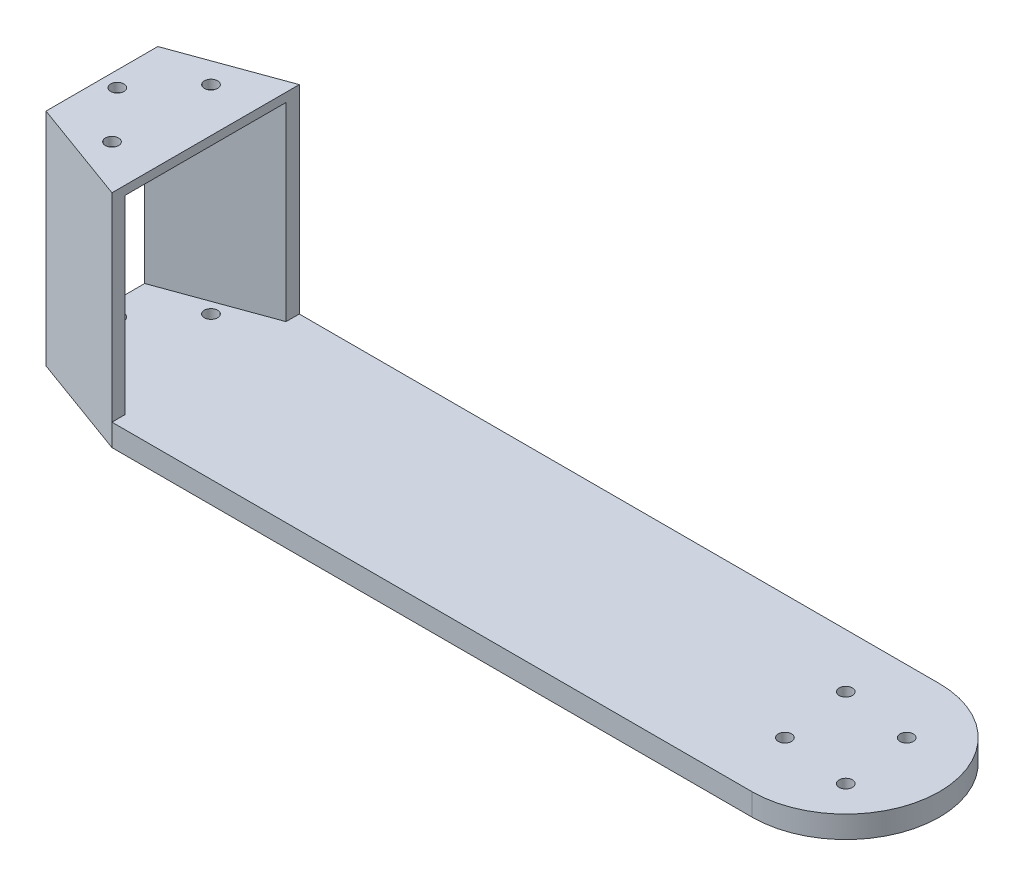
ISO-10303-21;
HEADER;
FILE_DESCRIPTION(('STEP AP214'),'2;1');
FILE_NAME('part.step','',(''),(''),'','','');
FILE_SCHEMA(('AUTOMOTIVE_DESIGN { 1 0 10303 214 1 1 1 1 }'));
ENDSEC;
DATA;
#1=APPLICATION_CONTEXT('core data for automotive mechanical design processes');
#2=APPLICATION_PROTOCOL_DEFINITION('international standard','automotive_design',2000,#1);
#3=PRODUCT_CONTEXT('',#1,'mechanical');
#4=PRODUCT('Part','Part','',(#3));
#5=PRODUCT_RELATED_PRODUCT_CATEGORY('part','',(#4));
#6=PRODUCT_DEFINITION_FORMATION('','',#4);
#7=PRODUCT_DEFINITION_CONTEXT('part definition',#1,'design');
#8=PRODUCT_DEFINITION('design','',#6,#7);
#9=PRODUCT_DEFINITION_SHAPE('','',#8);
#10=(LENGTH_UNIT() NAMED_UNIT(*) SI_UNIT(.MILLI.,.METRE.));
#11=(NAMED_UNIT(*) PLANE_ANGLE_UNIT() SI_UNIT($,.RADIAN.));
#12=(NAMED_UNIT(*) SI_UNIT($,.STERADIAN.) SOLID_ANGLE_UNIT());
#13=UNCERTAINTY_MEASURE_WITH_UNIT(LENGTH_MEASURE(1.E-05),#10,'distance_accuracy_value','');
#14=(GEOMETRIC_REPRESENTATION_CONTEXT(3) GLOBAL_UNCERTAINTY_ASSIGNED_CONTEXT((#13)) GLOBAL_UNIT_ASSIGNED_CONTEXT((#10,
#11,#12)) REPRESENTATION_CONTEXT('',''));
#15=CARTESIAN_POINT('',(0.,0.,0.));
#16=DIRECTION('',(0.,0.,1.));
#17=DIRECTION('',(1.,0.,0.));
#18=AXIS2_PLACEMENT_3D('',#15,#16,#17);
#19=CARTESIAN_POINT('',(49.3147291292976,5.,-35.8156635552348));
#20=DIRECTION('',(1.,0.,0.));
#21=DIRECTION('',(0.,0.,-1.));
#22=AXIS2_PLACEMENT_3D('',#19,#20,#21);
#23=PLANE('',#22);
#24=DIRECTION('',(0.,0.,1.));
#25=VECTOR('',#24,1.);
#26=CARTESIAN_POINT('',(49.3147291292976,0.,-35.8156635552348));
#27=LINE('',#26,#25);
#28=CARTESIAN_POINT('',(49.3147291292976,0.,-35.8156635552348));
#29=VERTEX_POINT('',#28);
#30=CARTESIAN_POINT('',(49.3147291292976,0.,-10.4866707215182));
#31=VERTEX_POINT('',#30);
#32=EDGE_CURVE('E242',#29,#31,#27,.T.);
#33=ORIENTED_EDGE('',*,*,#32,.T.);
#34=DIRECTION('',(0.,-1.,0.));
#35=VECTOR('',#34,1.);
#36=CARTESIAN_POINT('',(49.3147291292976,5.,-10.4866707215182));
#37=LINE('',#36,#35);
#38=CARTESIAN_POINT('',(49.3147291292976,50.,-10.4866707215182));
#39=VERTEX_POINT('',#38);
#40=EDGE_CURVE('E247',#39,#31,#37,.T.);
#41=ORIENTED_EDGE('',*,*,#40,.F.);
#42=DIRECTION('',(0.,0.,1.));
#43=VECTOR('',#42,1.);
#44=CARTESIAN_POINT('',(49.3147291292976,50.,-10.4866707215182));
#45=LINE('',#44,#43);
#46=CARTESIAN_POINT('',(49.3147291292976,50.,-35.8156635552348));
#47=VERTEX_POINT('',#46);
#48=EDGE_CURVE('E165',#47,#39,#45,.T.);
#49=ORIENTED_EDGE('',*,*,#48,.F.);
#50=DIRECTION('',(0.,-1.,0.));
#51=VECTOR('',#50,1.);
#52=CARTESIAN_POINT('',(49.3147291292976,5.,-35.8156635552348));
#53=LINE('',#52,#51);
#54=EDGE_CURVE('E250',#47,#29,#53,.T.);
#55=ORIENTED_EDGE('',*,*,#54,.T.);
#56=EDGE_LOOP('',(#33,#41,#49,#55));
#57=FACE_BOUND('',#56,.T.);
#58=DIRECTION('',(0.,1.,0.));
#59=VECTOR('',#58,1.);
#60=CARTESIAN_POINT('',(49.3147291292976,5.,-13.4866707215182));
#61=LINE('',#60,#59);
#62=CARTESIAN_POINT('',(49.3147291292976,5.,-13.4866707215182));
#63=VERTEX_POINT('',#62);
#64=CARTESIAN_POINT('',(49.3147291292976,48.,-13.4866707215182));
#65=VERTEX_POINT('',#64);
#66=EDGE_CURVE('E200',#63,#65,#61,.T.);
#67=ORIENTED_EDGE('',*,*,#66,.F.);
#68=DIRECTION('',(0.,0.,1.));
#69=VECTOR('',#68,1.);
#70=CARTESIAN_POINT('',(49.3147291292976,5.,-13.4866707215182));
#71=LINE('',#70,#69);
#72=CARTESIAN_POINT('',(49.3147291292976,5.,-32.8395133739685));
#73=VERTEX_POINT('',#72);
#74=EDGE_CURVE('E152',#73,#63,#71,.T.);
#75=ORIENTED_EDGE('',*,*,#74,.F.);
#76=DIRECTION('',(0.,-1.,0.));
#77=VECTOR('',#76,1.);
#78=CARTESIAN_POINT('',(49.3147291292976,48.,-32.8395133739685));
#79=LINE('',#78,#77);
#80=CARTESIAN_POINT('',(49.3147291292976,48.,-32.8395133739685));
#81=VERTEX_POINT('',#80);
#82=EDGE_CURVE('E326',#81,#73,#79,.T.);
#83=ORIENTED_EDGE('',*,*,#82,.F.);
#84=DIRECTION('',(0.,0.,-1.));
#85=VECTOR('',#84,1.);
#86=CARTESIAN_POINT('',(49.3147291292976,48.,-13.4866707215182));
#87=LINE('',#86,#85);
#88=EDGE_CURVE('E64',#65,#81,#87,.T.);
#89=ORIENTED_EDGE('',*,*,#88,.F.);
#90=EDGE_LOOP('',(#67,#75,#83,#89));
#91=FACE_BOUND('',#90,.T.);
#92=ADVANCED_FACE('F47',(#57,#91),#23,.F.);
#93=CARTESIAN_POINT('',(72.8070446489441,50.,-44.3661671383762));
#94=DIRECTION('',(-1.,0.,0.));
#95=DIRECTION('',(0.,0.,1.));
#96=AXIS2_PLACEMENT_3D('',#93,#94,#95);
#97=PLANE('',#96);
#98=DIRECTION('',(0.,-1.,0.));
#99=VECTOR('',#98,1.);
#100=CARTESIAN_POINT('',(72.8070446489452,5.,-4.93616713837249));
#101=LINE('',#100,#99);
#102=CARTESIAN_POINT('',(72.8070446489452,48.,-4.93616713837249));
#103=VERTEX_POINT('',#102);
#104=CARTESIAN_POINT('',(72.8070446489452,5.,-4.93616713837249));
#105=VERTEX_POINT('',#104);
#106=EDGE_CURVE('E134',#103,#105,#101,.T.);
#107=ORIENTED_EDGE('',*,*,#106,.F.);
#108=DIRECTION('',(0.,0.,1.));
#109=VECTOR('',#108,1.);
#110=CARTESIAN_POINT('',(72.8070446489452,48.,-4.93616713837249));
#111=LINE('',#110,#109);
#112=CARTESIAN_POINT('',(72.8070446489442,48.,-41.3661671383762));
#113=VERTEX_POINT('',#112);
#114=EDGE_CURVE('E143',#113,#103,#111,.T.);
#115=ORIENTED_EDGE('',*,*,#114,.F.);
#116=DIRECTION('',(0.,1.,0.));
#117=VECTOR('',#116,1.);
#118=CARTESIAN_POINT('',(72.8070446489442,48.,-41.3661671383762));
#119=LINE('',#118,#117);
#120=CARTESIAN_POINT('',(72.8070446489442,5.,-41.3661671383762));
#121=VERTEX_POINT('',#120);
#122=EDGE_CURVE('E283',#121,#113,#119,.T.);
#123=ORIENTED_EDGE('',*,*,#122,.F.);
#124=DIRECTION('',(0.,0.,-1.));
#125=VECTOR('',#124,1.);
#126=CARTESIAN_POINT('',(72.8070446489441,5.,-44.3661671383762));
#127=LINE('',#126,#125);
#128=CARTESIAN_POINT('',(72.8070446489441,5.,-44.3661671383762));
#129=VERTEX_POINT('',#128);
#130=EDGE_CURVE('E162',#121,#129,#127,.T.);
#131=ORIENTED_EDGE('',*,*,#130,.T.);
#132=DIRECTION('',(0.,-1.,0.));
#133=VECTOR('',#132,1.);
#134=CARTESIAN_POINT('',(72.8070446489441,50.,-44.3661671383762));
#135=LINE('',#134,#133);
#136=CARTESIAN_POINT('',(72.8070446489441,50.,-44.3661671383762));
#137=VERTEX_POINT('',#136);
#138=EDGE_CURVE('E177',#137,#129,#135,.T.);
#139=ORIENTED_EDGE('',*,*,#138,.F.);
#140=DIRECTION('',(0.,0.,-1.));
#141=VECTOR('',#140,1.);
#142=CARTESIAN_POINT('',(72.8070446489441,50.,-44.3661671383762));
#143=LINE('',#142,#141);
#144=CARTESIAN_POINT('',(72.8070446489453,50.,-1.93616713837657));
#145=VERTEX_POINT('',#144);
#146=EDGE_CURVE('E175',#145,#137,#143,.T.);
#147=ORIENTED_EDGE('',*,*,#146,.F.);
#148=DIRECTION('',(0.,-1.,0.));
#149=VECTOR('',#148,1.);
#150=CARTESIAN_POINT('',(72.8070446489453,50.,-1.93616713837657));
#151=LINE('',#150,#149);
#152=CARTESIAN_POINT('',(72.8070446489453,5.,-1.93616713837657));
#153=VERTEX_POINT('',#152);
#154=EDGE_CURVE('E160',#145,#153,#151,.T.);
#155=ORIENTED_EDGE('',*,*,#154,.T.);
#156=EDGE_CURVE('E149',#153,#105,#127,.T.);
#157=ORIENTED_EDGE('',*,*,#156,.T.);
#158=EDGE_LOOP('',(#107,#115,#123,#131,#139,#147,#155,#157));
#159=FACE_BOUND('',#158,.T.);
#160=ADVANCED_FACE('F157',(#159),#97,.F.);
#161=CARTESIAN_POINT('',(217.807044648945,5.,-23.1511671383764));
#162=DIRECTION('',(0.,-1.,0.));
#163=DIRECTION('',(0.,0.,-1.));
#164=AXIS2_PLACEMENT_3D('',#161,#162,#163);
#165=PLANE('',#164);
#166=CARTESIAN_POINT('',(226.822656109074,5.,-14.1355556782479));
#167=DIRECTION('',(0.,-1.,0.));
#168=DIRECTION('',(0.,0.,-1.));
#169=AXIS2_PLACEMENT_3D('',#166,#167,#168);
#170=CIRCLE('',#169,1.5);
#171=CARTESIAN_POINT('',(226.822656109074,5.,-15.6355556782479));
#172=VERTEX_POINT('',#171);
#173=EDGE_CURVE('E219',#172,#172,#170,.T.);
#174=ORIENTED_EDGE('',*,*,#173,.T.);
#175=EDGE_LOOP('',(#174));
#176=FACE_BOUND('',#175,.T.);
#177=CARTESIAN_POINT('',(224.701335765514,5.,-30.0454582549453));
#178=DIRECTION('',(0.,-1.,0.));
#179=DIRECTION('',(0.,0.,-1.));
#180=AXIS2_PLACEMENT_3D('',#177,#178,#179);
#181=CIRCLE('',#180,1.5);
#182=CARTESIAN_POINT('',(224.701335765514,5.,-31.5454582549453));
#183=VERTEX_POINT('',#182);
#184=EDGE_CURVE('E205',#183,#183,#181,.T.);
#185=ORIENTED_EDGE('',*,*,#184,.T.);
#186=EDGE_LOOP('',(#185));
#187=FACE_BOUND('',#186,.T.);
#188=CARTESIAN_POINT('',(208.791433188817,5.,-32.1667785985048));
#189=DIRECTION('',(0.,-1.,0.));
#190=DIRECTION('',(0.,0.,-1.));
#191=AXIS2_PLACEMENT_3D('',#188,#189,#190);
#192=CIRCLE('',#191,1.5);
#193=CARTESIAN_POINT('',(208.791433188817,5.,-33.6667785985048));
#194=VERTEX_POINT('',#193);
#195=EDGE_CURVE('E211',#194,#194,#192,.T.);
#196=ORIENTED_EDGE('',*,*,#195,.T.);
#197=EDGE_LOOP('',(#196));
#198=FACE_BOUND('',#197,.T.);
#199=CARTESIAN_POINT('',(210.912753532376,5.,-16.2568760218076));
#200=DIRECTION('',(0.,-1.,0.));
#201=DIRECTION('',(0.,0.,-1.));
#202=AXIS2_PLACEMENT_3D('',#199,#200,#201);
#203=CIRCLE('',#202,1.5);
#204=CARTESIAN_POINT('',(210.912753532376,5.,-17.7568760218076));
#205=VERTEX_POINT('',#204);
#206=EDGE_CURVE('E186',#205,#205,#203,.T.);
#207=ORIENTED_EDGE('',*,*,#206,.T.);
#208=EDGE_LOOP('',(#207));
#209=FACE_BOUND('',#208,.T.);
#210=ORIENTED_EDGE('',*,*,#156,.F.);
#211=DIRECTION('',(1.,0.,0.));
#212=VECTOR('',#211,1.);
#213=CARTESIAN_POINT('',(72.8070446489453,5.,-1.93616713837657));
#214=LINE('',#213,#212);
#215=CARTESIAN_POINT('',(217.807044648945,5.,-1.93616713837657));
#216=VERTEX_POINT('',#215);
#217=EDGE_CURVE('E225',#153,#216,#214,.T.);
#218=ORIENTED_EDGE('',*,*,#217,.T.);
#219=CARTESIAN_POINT('',(217.807044648945,5.,-23.1511671383764));
#220=DIRECTION('',(0.,1.,0.));
#221=DIRECTION('',(0.,0.,-1.));
#222=AXIS2_PLACEMENT_3D('',#219,#220,#221);
#223=CIRCLE('',#222,21.2149999999998);
#224=CARTESIAN_POINT('',(217.807044648944,5.,-44.3661671383762));
#225=VERTEX_POINT('',#224);
#226=EDGE_CURVE('E227',#216,#225,#223,.T.);
#227=ORIENTED_EDGE('',*,*,#226,.T.);
#228=DIRECTION('',(-1.,0.,0.));
#229=VECTOR('',#228,1.);
#230=CARTESIAN_POINT('',(72.8070446489441,5.,-44.3661671383762));
#231=LINE('',#230,#229);
#232=EDGE_CURVE('E230',#225,#129,#231,.T.);
#233=ORIENTED_EDGE('',*,*,#232,.T.);
#234=ORIENTED_EDGE('',*,*,#130,.F.);
#235=DIRECTION('',(-0.939998950262256,0.,0.341177334396434));
#236=VECTOR('',#235,1.);
#237=CARTESIAN_POINT('',(72.8070446489442,5.,-41.3661671383762));
#238=LINE('',#237,#236);
#239=EDGE_CURVE('E72',#121,#73,#238,.T.);
#240=ORIENTED_EDGE('',*,*,#239,.T.);
#241=ORIENTED_EDGE('',*,*,#74,.T.);
#242=DIRECTION('',(-0.939692620785857,0.,-0.342020143325811));
#243=VECTOR('',#242,1.);
#244=CARTESIAN_POINT('',(72.8070446489452,5.,-4.93616713837249));
#245=LINE('',#244,#243);
#246=EDGE_CURVE('E137',#105,#63,#245,.T.);
#247=ORIENTED_EDGE('',*,*,#246,.F.);
#248=EDGE_LOOP('',(#210,#218,#227,#233,#234,#240,#241,#247));
#249=FACE_BOUND('',#248,.T.);
#250=CARTESIAN_POINT('',(62.8070446489453,5.,-11.9361671383766));
#251=DIRECTION('',(0.,-1.,0.));
#252=DIRECTION('',(0.,0.,-1.));
#253=AXIS2_PLACEMENT_3D('',#250,#251,#252);
#254=CIRCLE('',#253,1.5);
#255=CARTESIAN_POINT('',(62.8070446489453,5.,-13.4361671383766));
#256=VERTEX_POINT('',#255);
#257=EDGE_CURVE('E197',#256,#256,#254,.T.);
#258=ORIENTED_EDGE('',*,*,#257,.T.);
#259=EDGE_LOOP('',(#258));
#260=FACE_BOUND('',#259,.T.);
#261=CARTESIAN_POINT('',(52.8070446489453,5.,-23.1511671383764));
#262=DIRECTION('',(0.,-1.,0.));
#263=DIRECTION('',(0.,0.,-1.));
#264=AXIS2_PLACEMENT_3D('',#261,#262,#263);
#265=CIRCLE('',#264,1.5);
#266=CARTESIAN_POINT('',(52.8070446489453,5.,-24.6511671383764));
#267=VERTEX_POINT('',#266);
#268=EDGE_CURVE('E194',#267,#267,#265,.T.);
#269=ORIENTED_EDGE('',*,*,#268,.T.);
#270=EDGE_LOOP('',(#269));
#271=FACE_BOUND('',#270,.T.);
#272=CARTESIAN_POINT('',(62.8070446489453,5.,-34.3661671383762));
#273=DIRECTION('',(0.,-1.,0.));
#274=DIRECTION('',(0.,0.,-1.));
#275=AXIS2_PLACEMENT_3D('',#272,#273,#274);
#276=CIRCLE('',#275,1.5);
#277=CARTESIAN_POINT('',(62.8070446489453,5.,-35.8661671383762));
#278=VERTEX_POINT('',#277);
#279=EDGE_CURVE('E167',#278,#278,#276,.T.);
#280=ORIENTED_EDGE('',*,*,#279,.T.);
#281=EDGE_LOOP('',(#280));
#282=FACE_BOUND('',#281,.T.);
#283=ADVANCED_FACE('F146',(#176,#187,#198,#209,#249,#260,#271,#282),#165,.F.);
#284=CARTESIAN_POINT('',(72.8070446489453,5.,-1.93616713837657));
#285=DIRECTION('',(0.,0.,-1.));
#286=DIRECTION('',(-1.,0.,0.));
#287=AXIS2_PLACEMENT_3D('',#284,#285,#286);
#288=PLANE('',#287);
#289=DIRECTION('',(1.,0.,0.));
#290=VECTOR('',#289,1.);
#291=CARTESIAN_POINT('',(72.8070446489453,0.,-1.93616713837657));
#292=LINE('',#291,#290);
#293=CARTESIAN_POINT('',(72.8070446489453,0.,-1.93616713837657));
#294=VERTEX_POINT('',#293);
#295=CARTESIAN_POINT('',(217.807044648945,0.,-1.93616713837657));
#296=VERTEX_POINT('',#295);
#297=EDGE_CURVE('E222',#294,#296,#292,.T.);
#298=ORIENTED_EDGE('',*,*,#297,.T.);
#299=DIRECTION('',(0.,-1.,0.));
#300=VECTOR('',#299,1.);
#301=CARTESIAN_POINT('',(217.807044648945,5.,-1.93616713837657));
#302=LINE('',#301,#300);
#303=EDGE_CURVE('E12',#216,#296,#302,.T.);
#304=ORIENTED_EDGE('',*,*,#303,.F.);
#305=ORIENTED_EDGE('',*,*,#217,.F.);
#306=DIRECTION('',(0.,-1.,0.));
#307=VECTOR('',#306,1.);
#308=CARTESIAN_POINT('',(72.8070446489453,5.,-1.93616713837657));
#309=LINE('',#308,#307);
#310=EDGE_CURVE('E233',#153,#294,#309,.T.);
#311=ORIENTED_EDGE('',*,*,#310,.T.);
#312=EDGE_LOOP('',(#298,#304,#305,#311));
#313=FACE_BOUND('',#312,.T.);
#314=ADVANCED_FACE('F49',(#313),#288,.F.);
#315=CARTESIAN_POINT('',(217.807044648945,5.,-23.1511671383764));
#316=DIRECTION('',(0.,-1.,0.));
#317=DIRECTION('',(0.,0.,-1.));
#318=AXIS2_PLACEMENT_3D('',#315,#316,#317);
#319=CYLINDRICAL_SURFACE('',#318,21.2149999999998);
#320=CARTESIAN_POINT('',(217.807044648945,0.,-23.1511671383764));
#321=DIRECTION('',(0.,1.,0.));
#322=DIRECTION('',(0.,0.,-1.));
#323=AXIS2_PLACEMENT_3D('',#320,#321,#322);
#324=CIRCLE('',#323,21.2149999999998);
#325=CARTESIAN_POINT('',(217.807044648944,0.,-44.3661671383762));
#326=VERTEX_POINT('',#325);
#327=EDGE_CURVE('E236',#296,#326,#324,.T.);
#328=ORIENTED_EDGE('',*,*,#327,.T.);
#329=DIRECTION('',(0.,-1.,0.));
#330=VECTOR('',#329,1.);
#331=CARTESIAN_POINT('',(217.807044648944,5.,-44.3661671383762));
#332=LINE('',#331,#330);
#333=EDGE_CURVE('E56',#225,#326,#332,.T.);
#334=ORIENTED_EDGE('',*,*,#333,.F.);
#335=ORIENTED_EDGE('',*,*,#226,.F.);
#336=ORIENTED_EDGE('',*,*,#303,.T.);
#337=EDGE_LOOP('',(#328,#334,#335,#336));
#338=FACE_BOUND('',#337,.T.);
#339=ADVANCED_FACE('F286',(#338),#319,.T.);
#340=CARTESIAN_POINT('',(72.8070446489441,5.,-44.3661671383762));
#341=DIRECTION('',(0.,0.,1.));
#342=DIRECTION('',(1.,0.,0.));
#343=AXIS2_PLACEMENT_3D('',#340,#341,#342);
#344=PLANE('',#343);
#345=DIRECTION('',(-1.,0.,0.));
#346=VECTOR('',#345,1.);
#347=CARTESIAN_POINT('',(72.8070446489441,0.,-44.3661671383762));
#348=LINE('',#347,#346);
#349=CARTESIAN_POINT('',(72.8070446489441,0.,-44.3661671383762));
#350=VERTEX_POINT('',#349);
#351=EDGE_CURVE('E238',#326,#350,#348,.T.);
#352=ORIENTED_EDGE('',*,*,#351,.T.);
#353=DIRECTION('',(0.,-1.,0.));
#354=VECTOR('',#353,1.);
#355=CARTESIAN_POINT('',(72.8070446489441,5.,-44.3661671383762));
#356=LINE('',#355,#354);
#357=EDGE_CURVE('E253',#129,#350,#356,.T.);
#358=ORIENTED_EDGE('',*,*,#357,.F.);
#359=ORIENTED_EDGE('',*,*,#232,.F.);
#360=ORIENTED_EDGE('',*,*,#333,.T.);
#361=EDGE_LOOP('',(#352,#358,#359,#360));
#362=FACE_BOUND('',#361,.T.);
#363=ADVANCED_FACE('F260',(#362),#344,.F.);
#364=CARTESIAN_POINT('',(72.8070446489441,5.,-44.3661671383762));
#365=DIRECTION('',(0.342020143325675,0.,0.939692620785906));
#366=DIRECTION('',(0.939692620785906,0.,-0.342020143325675));
#367=AXIS2_PLACEMENT_3D('',#364,#365,#366);
#368=PLANE('',#367);
#369=DIRECTION('',(-0.939692620785906,0.,0.342020143325675));
#370=VECTOR('',#369,1.);
#371=CARTESIAN_POINT('',(72.8070446489441,0.,-44.3661671383762));
#372=LINE('',#371,#370);
#373=EDGE_CURVE('E240',#350,#29,#372,.T.);
#374=ORIENTED_EDGE('',*,*,#373,.T.);
#375=ORIENTED_EDGE('',*,*,#54,.F.);
#376=DIRECTION('',(-0.939692620785906,0.,0.342020143325675));
#377=VECTOR('',#376,1.);
#378=CARTESIAN_POINT('',(49.3147291292976,50.,-35.8156635552348));
#379=LINE('',#378,#377);
#380=EDGE_CURVE('E161',#137,#47,#379,.T.);
#381=ORIENTED_EDGE('',*,*,#380,.F.);
#382=ORIENTED_EDGE('',*,*,#138,.T.);
#383=ORIENTED_EDGE('',*,*,#357,.T.);
#384=EDGE_LOOP('',(#374,#375,#381,#382,#383));
#385=FACE_BOUND('',#384,.T.);
#386=ADVANCED_FACE('F270',(#385),#368,.F.);
#387=CARTESIAN_POINT('',(72.8070446489453,5.,-1.93616713837657));
#388=DIRECTION('',(0.342020143325666,0.,-0.93969262078591));
#389=DIRECTION('',(-0.93969262078591,0.,-0.342020143325666));
#390=AXIS2_PLACEMENT_3D('',#387,#388,#389);
#391=PLANE('',#390);
#392=DIRECTION('',(0.93969262078591,0.,0.342020143325666));
#393=VECTOR('',#392,1.);
#394=CARTESIAN_POINT('',(72.8070446489453,0.,-1.93616713837657));
#395=LINE('',#394,#393);
#396=EDGE_CURVE('E228',#31,#294,#395,.T.);
#397=ORIENTED_EDGE('',*,*,#396,.T.);
#398=ORIENTED_EDGE('',*,*,#310,.F.);
#399=ORIENTED_EDGE('',*,*,#154,.F.);
#400=DIRECTION('',(0.93969262078591,0.,0.342020143325666));
#401=VECTOR('',#400,1.);
#402=CARTESIAN_POINT('',(72.8070446489453,50.,-1.93616713837657));
#403=LINE('',#402,#401);
#404=EDGE_CURVE('E278',#39,#145,#403,.T.);
#405=ORIENTED_EDGE('',*,*,#404,.F.);
#406=ORIENTED_EDGE('',*,*,#40,.T.);
#407=EDGE_LOOP('',(#397,#398,#399,#405,#406));
#408=FACE_BOUND('',#407,.T.);
#409=ADVANCED_FACE('F289',(#408),#391,.F.);
#410=CARTESIAN_POINT('',(217.807044648945,0.,-23.1511671383764));
#411=DIRECTION('',(0.,-1.,0.));
#412=DIRECTION('',(0.,0.,-1.));
#413=AXIS2_PLACEMENT_3D('',#410,#411,#412);
#414=PLANE('',#413);
#415=CARTESIAN_POINT('',(62.8070446489453,0.,-11.9361671383766));
#416=DIRECTION('',(0.,-1.,0.));
#417=DIRECTION('',(0.,0.,-1.));
#418=AXIS2_PLACEMENT_3D('',#415,#416,#417);
#419=CIRCLE('',#418,1.5);
#420=CARTESIAN_POINT('',(62.8070446489453,0.,-13.4361671383766));
#421=VERTEX_POINT('',#420);
#422=EDGE_CURVE('E183',#421,#421,#419,.T.);
#423=ORIENTED_EDGE('',*,*,#422,.F.);
#424=EDGE_LOOP('',(#423));
#425=FACE_BOUND('',#424,.T.);
#426=CARTESIAN_POINT('',(52.8070446489453,0.,-23.1511671383764));
#427=DIRECTION('',(0.,-1.,0.));
#428=DIRECTION('',(0.,0.,-1.));
#429=AXIS2_PLACEMENT_3D('',#426,#427,#428);
#430=CIRCLE('',#429,1.5);
#431=CARTESIAN_POINT('',(52.8070446489453,0.,-24.6511671383764));
#432=VERTEX_POINT('',#431);
#433=EDGE_CURVE('E187',#432,#432,#430,.T.);
#434=ORIENTED_EDGE('',*,*,#433,.F.);
#435=EDGE_LOOP('',(#434));
#436=FACE_BOUND('',#435,.T.);
#437=CARTESIAN_POINT('',(62.8070446489453,0.,-34.3661671383762));
#438=DIRECTION('',(0.,-1.,0.));
#439=DIRECTION('',(0.,0.,-1.));
#440=AXIS2_PLACEMENT_3D('',#437,#438,#439);
#441=CIRCLE('',#440,1.5);
#442=CARTESIAN_POINT('',(62.8070446489453,0.,-35.8661671383762));
#443=VERTEX_POINT('',#442);
#444=EDGE_CURVE('E182',#443,#443,#441,.T.);
#445=ORIENTED_EDGE('',*,*,#444,.F.);
#446=EDGE_LOOP('',(#445));
#447=FACE_BOUND('',#446,.T.);
#448=CARTESIAN_POINT('',(210.912753532376,0.,-16.2568760218076));
#449=DIRECTION('',(0.,-1.,0.));
#450=DIRECTION('',(0.,0.,-1.));
#451=AXIS2_PLACEMENT_3D('',#448,#449,#450);
#452=CIRCLE('',#451,1.5);
#453=CARTESIAN_POINT('',(210.912753532376,0.,-17.7568760218076));
#454=VERTEX_POINT('',#453);
#455=EDGE_CURVE('E214',#454,#454,#452,.T.);
#456=ORIENTED_EDGE('',*,*,#455,.F.);
#457=EDGE_LOOP('',(#456));
#458=FACE_BOUND('',#457,.T.);
#459=CARTESIAN_POINT('',(208.791433188817,0.,-32.1667785985048));
#460=DIRECTION('',(0.,-1.,0.));
#461=DIRECTION('',(0.,0.,-1.));
#462=AXIS2_PLACEMENT_3D('',#459,#460,#461);
#463=CIRCLE('',#462,1.5);
#464=CARTESIAN_POINT('',(208.791433188817,0.,-33.6667785985048));
#465=VERTEX_POINT('',#464);
#466=EDGE_CURVE('E208',#465,#465,#463,.T.);
#467=ORIENTED_EDGE('',*,*,#466,.F.);
#468=EDGE_LOOP('',(#467));
#469=FACE_BOUND('',#468,.T.);
#470=CARTESIAN_POINT('',(224.701335765514,0.,-30.0454582549453));
#471=DIRECTION('',(0.,-1.,0.));
#472=DIRECTION('',(0.,0.,-1.));
#473=AXIS2_PLACEMENT_3D('',#470,#471,#472);
#474=CIRCLE('',#473,1.5);
#475=CARTESIAN_POINT('',(224.701335765514,0.,-31.5454582549453));
#476=VERTEX_POINT('',#475);
#477=EDGE_CURVE('E201',#476,#476,#474,.T.);
#478=ORIENTED_EDGE('',*,*,#477,.F.);
#479=EDGE_LOOP('',(#478));
#480=FACE_BOUND('',#479,.T.);
#481=CARTESIAN_POINT('',(226.822656109074,0.,-14.1355556782479));
#482=DIRECTION('',(0.,-1.,0.));
#483=DIRECTION('',(0.,0.,-1.));
#484=AXIS2_PLACEMENT_3D('',#481,#482,#483);
#485=CIRCLE('',#484,1.5);
#486=CARTESIAN_POINT('',(226.822656109074,0.,-15.6355556782479));
#487=VERTEX_POINT('',#486);
#488=EDGE_CURVE('E204',#487,#487,#485,.T.);
#489=ORIENTED_EDGE('',*,*,#488,.F.);
#490=EDGE_LOOP('',(#489));
#491=FACE_BOUND('',#490,.T.);
#492=ORIENTED_EDGE('',*,*,#297,.F.);
#493=ORIENTED_EDGE('',*,*,#396,.F.);
#494=ORIENTED_EDGE('',*,*,#32,.F.);
#495=ORIENTED_EDGE('',*,*,#373,.F.);
#496=ORIENTED_EDGE('',*,*,#351,.F.);
#497=ORIENTED_EDGE('',*,*,#327,.F.);
#498=EDGE_LOOP('',(#492,#493,#494,#495,#496,#497));
#499=FACE_BOUND('',#498,.T.);
#500=ADVANCED_FACE('F266',(#425,#436,#447,#458,#469,#480,#491,#499),#414,.T.);
#501=CARTESIAN_POINT('',(226.822656109074,5.,-14.1355556782479));
#502=DIRECTION('',(0.,-1.,0.));
#503=DIRECTION('',(0.,0.,-1.));
#504=AXIS2_PLACEMENT_3D('',#501,#502,#503);
#505=CYLINDRICAL_SURFACE('',#504,1.5);
#506=ORIENTED_EDGE('',*,*,#173,.F.);
#507=EDGE_LOOP('',(#506));
#508=FACE_BOUND('',#507,.T.);
#509=ORIENTED_EDGE('',*,*,#488,.T.);
#510=EDGE_LOOP('',(#509));
#511=FACE_BOUND('',#510,.T.);
#512=ADVANCED_FACE('F372',(#508,#511),#505,.F.);
#513=CARTESIAN_POINT('',(224.701335765514,5.,-30.0454582549453));
#514=DIRECTION('',(0.,-1.,0.));
#515=DIRECTION('',(0.,0.,-1.));
#516=AXIS2_PLACEMENT_3D('',#513,#514,#515);
#517=CYLINDRICAL_SURFACE('',#516,1.5);
#518=ORIENTED_EDGE('',*,*,#184,.F.);
#519=EDGE_LOOP('',(#518));
#520=FACE_BOUND('',#519,.T.);
#521=ORIENTED_EDGE('',*,*,#477,.T.);
#522=EDGE_LOOP('',(#521));
#523=FACE_BOUND('',#522,.T.);
#524=ADVANCED_FACE('F381',(#520,#523),#517,.F.);
#525=CARTESIAN_POINT('',(208.791433188817,5.,-32.1667785985048));
#526=DIRECTION('',(0.,-1.,0.));
#527=DIRECTION('',(0.,0.,-1.));
#528=AXIS2_PLACEMENT_3D('',#525,#526,#527);
#529=CYLINDRICAL_SURFACE('',#528,1.5);
#530=ORIENTED_EDGE('',*,*,#195,.F.);
#531=EDGE_LOOP('',(#530));
#532=FACE_BOUND('',#531,.T.);
#533=ORIENTED_EDGE('',*,*,#466,.T.);
#534=EDGE_LOOP('',(#533));
#535=FACE_BOUND('',#534,.T.);
#536=ADVANCED_FACE('F400',(#532,#535),#529,.F.);
#537=CARTESIAN_POINT('',(210.912753532376,5.,-16.2568760218076));
#538=DIRECTION('',(0.,-1.,0.));
#539=DIRECTION('',(0.,0.,-1.));
#540=AXIS2_PLACEMENT_3D('',#537,#538,#539);
#541=CYLINDRICAL_SURFACE('',#540,1.5);
#542=ORIENTED_EDGE('',*,*,#206,.F.);
#543=EDGE_LOOP('',(#542));
#544=FACE_BOUND('',#543,.T.);
#545=ORIENTED_EDGE('',*,*,#455,.T.);
#546=EDGE_LOOP('',(#545));
#547=FACE_BOUND('',#546,.T.);
#548=ADVANCED_FACE('F406',(#544,#547),#541,.F.);
#549=CARTESIAN_POINT('',(62.8070446489453,50.,-34.3661671383762));
#550=DIRECTION('',(0.,-1.,0.));
#551=DIRECTION('',(0.,0.,-1.));
#552=AXIS2_PLACEMENT_3D('',#549,#550,#551);
#553=CYLINDRICAL_SURFACE('',#552,1.5);
#554=ORIENTED_EDGE('',*,*,#444,.T.);
#555=EDGE_LOOP('',(#554));
#556=FACE_BOUND('',#555,.T.);
#557=ORIENTED_EDGE('',*,*,#279,.F.);
#558=EDGE_LOOP('',(#557));
#559=FACE_BOUND('',#558,.T.);
#560=ADVANCED_FACE('F411',(#556,#559),#553,.F.);
#561=CARTESIAN_POINT('',(52.8070446489453,50.,-23.1511671383764));
#562=DIRECTION('',(0.,-1.,0.));
#563=DIRECTION('',(0.,0.,-1.));
#564=AXIS2_PLACEMENT_3D('',#561,#562,#563);
#565=CYLINDRICAL_SURFACE('',#564,1.5);
#566=ORIENTED_EDGE('',*,*,#433,.T.);
#567=EDGE_LOOP('',(#566));
#568=FACE_BOUND('',#567,.T.);
#569=ORIENTED_EDGE('',*,*,#268,.F.);
#570=EDGE_LOOP('',(#569));
#571=FACE_BOUND('',#570,.T.);
#572=ADVANCED_FACE('F417',(#568,#571),#565,.F.);
#573=CARTESIAN_POINT('',(62.8070446489453,50.,-11.9361671383766));
#574=DIRECTION('',(0.,-1.,0.));
#575=DIRECTION('',(0.,0.,-1.));
#576=AXIS2_PLACEMENT_3D('',#573,#574,#575);
#577=CYLINDRICAL_SURFACE('',#576,1.5);
#578=ORIENTED_EDGE('',*,*,#422,.T.);
#579=EDGE_LOOP('',(#578));
#580=FACE_BOUND('',#579,.T.);
#581=ORIENTED_EDGE('',*,*,#257,.F.);
#582=EDGE_LOOP('',(#581));
#583=FACE_BOUND('',#582,.T.);
#584=ADVANCED_FACE('F424',(#580,#583),#577,.F.);
#585=CARTESIAN_POINT('',(0.,50.,0.));
#586=DIRECTION('',(0.,-1.,0.));
#587=DIRECTION('',(0.,0.,-1.));
#588=AXIS2_PLACEMENT_3D('',#585,#586,#587);
#589=PLANE('',#588);
#590=CARTESIAN_POINT('',(62.8070446489442,50.,-34.3661671383762));
#591=DIRECTION('',(0.,1.,0.));
#592=DIRECTION('',(0.,0.,1.));
#593=AXIS2_PLACEMENT_3D('',#590,#591,#592);
#594=CIRCLE('',#593,1.5);
#595=CARTESIAN_POINT('',(62.8070446489442,50.,-32.8661671383762));
#596=VERTEX_POINT('',#595);
#597=EDGE_CURVE('E308',#596,#596,#594,.T.);
#598=ORIENTED_EDGE('',*,*,#597,.F.);
#599=EDGE_LOOP('',(#598));
#600=FACE_BOUND('',#599,.T.);
#601=CARTESIAN_POINT('',(52.8070446489453,50.,-23.1511671383764));
#602=DIRECTION('',(0.,1.,0.));
#603=DIRECTION('',(0.,0.,1.));
#604=AXIS2_PLACEMENT_3D('',#601,#602,#603);
#605=CIRCLE('',#604,1.5);
#606=CARTESIAN_POINT('',(52.8070446489453,50.,-21.6511671383764));
#607=VERTEX_POINT('',#606);
#608=EDGE_CURVE('E305',#607,#607,#605,.T.);
#609=ORIENTED_EDGE('',*,*,#608,.F.);
#610=EDGE_LOOP('',(#609));
#611=FACE_BOUND('',#610,.T.);
#612=CARTESIAN_POINT('',(62.8070446489453,50.,-11.9361671383766));
#613=DIRECTION('',(0.,1.,0.));
#614=DIRECTION('',(0.,0.,1.));
#615=AXIS2_PLACEMENT_3D('',#612,#613,#614);
#616=CIRCLE('',#615,1.5);
#617=CARTESIAN_POINT('',(62.8070446489453,50.,-10.4361671383766));
#618=VERTEX_POINT('',#617);
#619=EDGE_CURVE('E302',#618,#618,#616,.T.);
#620=ORIENTED_EDGE('',*,*,#619,.F.);
#621=EDGE_LOOP('',(#620));
#622=FACE_BOUND('',#621,.T.);
#623=ORIENTED_EDGE('',*,*,#380,.T.);
#624=ORIENTED_EDGE('',*,*,#48,.T.);
#625=ORIENTED_EDGE('',*,*,#404,.T.);
#626=ORIENTED_EDGE('',*,*,#146,.T.);
#627=EDGE_LOOP('',(#623,#624,#625,#626));
#628=FACE_BOUND('',#627,.T.);
#629=ADVANCED_FACE('F280',(#600,#611,#622,#628),#589,.F.);
#630=CARTESIAN_POINT('',(10.1032598758042,0.,-27.7584783716409));
#631=DIRECTION('',(0.342020143325811,0.,-0.939692620785857));
#632=DIRECTION('',(-0.939692620785857,0.,-0.342020143325811));
#633=AXIS2_PLACEMENT_3D('',#630,#631,#632);
#634=PLANE('',#633);
#635=DIRECTION('',(-0.939692620785857,0.,-0.342020143325811));
#636=VECTOR('',#635,1.);
#637=CARTESIAN_POINT('',(72.8070446489452,48.,-4.93616713837249));
#638=LINE('',#637,#636);
#639=EDGE_CURVE('E139',#103,#65,#638,.T.);
#640=ORIENTED_EDGE('',*,*,#639,.F.);
#641=ORIENTED_EDGE('',*,*,#106,.T.);
#642=ORIENTED_EDGE('',*,*,#246,.T.);
#643=ORIENTED_EDGE('',*,*,#66,.T.);
#644=EDGE_LOOP('',(#640,#641,#642,#643));
#645=FACE_BOUND('',#644,.T.);
#646=ADVANCED_FACE('F136',(#645),#634,.T.);
#647=CARTESIAN_POINT('',(0.,48.,0.));
#648=DIRECTION('',(0.,-1.,0.));
#649=DIRECTION('',(0.,0.,-1.));
#650=AXIS2_PLACEMENT_3D('',#647,#648,#649);
#651=PLANE('',#650);
#652=CARTESIAN_POINT('',(62.8070446489442,48.,-34.3661671383762));
#653=DIRECTION('',(0.,-1.,0.));
#654=DIRECTION('',(0.,0.,-1.));
#655=AXIS2_PLACEMENT_3D('',#652,#653,#654);
#656=CIRCLE('',#655,1.5);
#657=CARTESIAN_POINT('',(62.8070446489442,48.,-32.8661671383762));
#658=VERTEX_POINT('',#657);
#659=EDGE_CURVE('E51',#658,#658,#656,.T.);
#660=ORIENTED_EDGE('',*,*,#659,.F.);
#661=EDGE_LOOP('',(#660));
#662=FACE_BOUND('',#661,.T.);
#663=CARTESIAN_POINT('',(52.8070446489453,48.,-23.1511671383764));
#664=DIRECTION('',(0.,-1.,0.));
#665=DIRECTION('',(0.,0.,-1.));
#666=AXIS2_PLACEMENT_3D('',#663,#664,#665);
#667=CIRCLE('',#666,1.5);
#668=CARTESIAN_POINT('',(52.8070446489453,48.,-21.6511671383764));
#669=VERTEX_POINT('',#668);
#670=EDGE_CURVE('E314',#669,#669,#667,.T.);
#671=ORIENTED_EDGE('',*,*,#670,.F.);
#672=EDGE_LOOP('',(#671));
#673=FACE_BOUND('',#672,.T.);
#674=CARTESIAN_POINT('',(62.8070446489453,48.,-11.9361671383766));
#675=DIRECTION('',(0.,-1.,0.));
#676=DIRECTION('',(0.,0.,-1.));
#677=AXIS2_PLACEMENT_3D('',#674,#675,#676);
#678=CIRCLE('',#677,1.5);
#679=CARTESIAN_POINT('',(62.8070446489453,48.,-10.4361671383766));
#680=VERTEX_POINT('',#679);
#681=EDGE_CURVE('E310',#680,#680,#678,.T.);
#682=ORIENTED_EDGE('',*,*,#681,.F.);
#683=EDGE_LOOP('',(#682));
#684=FACE_BOUND('',#683,.T.);
#685=DIRECTION('',(-0.939998950262256,0.,0.341177334396434));
#686=VECTOR('',#685,1.);
#687=CARTESIAN_POINT('',(72.8070446489442,48.,-41.3661671383762));
#688=LINE('',#687,#686);
#689=EDGE_CURVE('E154',#113,#81,#688,.T.);
#690=ORIENTED_EDGE('',*,*,#689,.F.);
#691=ORIENTED_EDGE('',*,*,#114,.T.);
#692=ORIENTED_EDGE('',*,*,#639,.T.);
#693=ORIENTED_EDGE('',*,*,#88,.T.);
#694=EDGE_LOOP('',(#690,#691,#692,#693));
#695=FACE_BOUND('',#694,.T.);
#696=ADVANCED_FACE('F341',(#662,#673,#684,#695),#651,.T.);
#697=CARTESIAN_POINT('',(-4.79150822273707,0.,-13.2013831092084));
#698=DIRECTION('',(0.341177334396434,0.,0.939998950262256));
#699=DIRECTION('',(0.939998950262256,0.,-0.341177334396434));
#700=AXIS2_PLACEMENT_3D('',#697,#698,#699);
#701=PLANE('',#700);
#702=ORIENTED_EDGE('',*,*,#239,.F.);
#703=ORIENTED_EDGE('',*,*,#122,.T.);
#704=ORIENTED_EDGE('',*,*,#689,.T.);
#705=ORIENTED_EDGE('',*,*,#82,.T.);
#706=EDGE_LOOP('',(#702,#703,#704,#705));
#707=FACE_BOUND('',#706,.T.);
#708=ADVANCED_FACE('F339',(#707),#701,.T.);
#709=CARTESIAN_POINT('',(62.8070446489453,5.,-11.9361671383766));
#710=DIRECTION('',(0.,1.,0.));
#711=DIRECTION('',(0.,0.,1.));
#712=AXIS2_PLACEMENT_3D('',#709,#710,#711);
#713=CYLINDRICAL_SURFACE('',#712,1.5);
#714=CARTESIAN_POINT('',(62.8070446489453,48.,-10.4361671383766));
#715=CARTESIAN_POINT('',(62.8070446489453,48.0208333333333,-10.4361671383766));
#716=CARTESIAN_POINT('',(62.8070446489453,48.0416666666667,-10.4361671383766));
#717=CARTESIAN_POINT('',(62.8070446489453,48.0833333333333,-10.4361671383766));
#718=CARTESIAN_POINT('',(62.8070446489453,48.1041666666667,-10.4361671383766));
#719=CARTESIAN_POINT('',(62.8070446489453,48.1458333333333,-10.4361671383766));
#720=CARTESIAN_POINT('',(62.8070446489453,48.1666666666667,-10.4361671383766));
#721=CARTESIAN_POINT('',(62.8070446489453,48.2083333333333,-10.4361671383766));
#722=CARTESIAN_POINT('',(62.8070446489453,48.2291666666667,-10.4361671383766));
#723=CARTESIAN_POINT('',(62.8070446489453,48.2708333333333,-10.4361671383766));
#724=CARTESIAN_POINT('',(62.8070446489453,48.2916666666667,-10.4361671383766));
#725=CARTESIAN_POINT('',(62.8070446489453,48.3333333333333,-10.4361671383766));
#726=CARTESIAN_POINT('',(62.8070446489453,48.3541666666667,-10.4361671383766));
#727=CARTESIAN_POINT('',(62.8070446489453,48.3958333333333,-10.4361671383766));
#728=CARTESIAN_POINT('',(62.8070446489453,48.4166666666667,-10.4361671383766));
#729=CARTESIAN_POINT('',(62.8070446489453,48.4583333333333,-10.4361671383766));
#730=CARTESIAN_POINT('',(62.8070446489453,48.4791666666667,-10.4361671383766));
#731=CARTESIAN_POINT('',(62.8070446489453,48.5208333333333,-10.4361671383766));
#732=CARTESIAN_POINT('',(62.8070446489453,48.5416666666667,-10.4361671383766));
#733=CARTESIAN_POINT('',(62.8070446489453,48.5833333333333,-10.4361671383766));
#734=CARTESIAN_POINT('',(62.8070446489453,48.6041666666667,-10.4361671383766));
#735=CARTESIAN_POINT('',(62.8070446489453,48.6458333333333,-10.4361671383766));
#736=CARTESIAN_POINT('',(62.8070446489453,48.6666666666667,-10.4361671383766));
#737=CARTESIAN_POINT('',(62.8070446489453,48.7083333333333,-10.4361671383766));
#738=CARTESIAN_POINT('',(62.8070446489453,48.7291666666667,-10.4361671383766));
#739=CARTESIAN_POINT('',(62.8070446489453,48.7708333333333,-10.4361671383766));
#740=CARTESIAN_POINT('',(62.8070446489453,48.7916666666667,-10.4361671383766));
#741=CARTESIAN_POINT('',(62.8070446489453,48.8333333333333,-10.4361671383766));
#742=CARTESIAN_POINT('',(62.8070446489453,48.8541666666667,-10.4361671383766));
#743=CARTESIAN_POINT('',(62.8070446489453,48.8958333333333,-10.4361671383766));
#744=CARTESIAN_POINT('',(62.8070446489453,48.9166666666667,-10.4361671383766));
#745=CARTESIAN_POINT('',(62.8070446489453,48.9583333333333,-10.4361671383766));
#746=CARTESIAN_POINT('',(62.8070446489453,48.9791666666667,-10.4361671383766));
#747=CARTESIAN_POINT('',(62.8070446489453,49.0208333333333,-10.4361671383766));
#748=CARTESIAN_POINT('',(62.8070446489453,49.0416666666667,-10.4361671383766));
#749=CARTESIAN_POINT('',(62.8070446489453,49.0833333333333,-10.4361671383766));
#750=CARTESIAN_POINT('',(62.8070446489453,49.1041666666667,-10.4361671383766));
#751=CARTESIAN_POINT('',(62.8070446489453,49.1458333333333,-10.4361671383766));
#752=CARTESIAN_POINT('',(62.8070446489453,49.1666666666667,-10.4361671383766));
#753=CARTESIAN_POINT('',(62.8070446489453,49.2083333333333,-10.4361671383766));
#754=CARTESIAN_POINT('',(62.8070446489453,49.2291666666667,-10.4361671383766));
#755=CARTESIAN_POINT('',(62.8070446489453,49.2708333333333,-10.4361671383766));
#756=CARTESIAN_POINT('',(62.8070446489453,49.2916666666667,-10.4361671383766));
#757=CARTESIAN_POINT('',(62.8070446489453,49.3333333333333,-10.4361671383766));
#758=CARTESIAN_POINT('',(62.8070446489453,49.3541666666667,-10.4361671383766));
#759=CARTESIAN_POINT('',(62.8070446489453,49.3958333333333,-10.4361671383766));
#760=CARTESIAN_POINT('',(62.8070446489453,49.4166666666667,-10.4361671383766));
#761=CARTESIAN_POINT('',(62.8070446489453,49.4583333333333,-10.4361671383766));
#762=CARTESIAN_POINT('',(62.8070446489453,49.4791666666667,-10.4361671383766));
#763=CARTESIAN_POINT('',(62.8070446489453,49.5208333333333,-10.4361671383766));
#764=CARTESIAN_POINT('',(62.8070446489453,49.5416666666667,-10.4361671383766));
#765=CARTESIAN_POINT('',(62.8070446489453,49.5833333333333,-10.4361671383766));
#766=CARTESIAN_POINT('',(62.8070446489453,49.6041666666667,-10.4361671383766));
#767=CARTESIAN_POINT('',(62.8070446489453,49.6458333333333,-10.4361671383766));
#768=CARTESIAN_POINT('',(62.8070446489453,49.6666666666667,-10.4361671383766));
#769=CARTESIAN_POINT('',(62.8070446489453,49.7083333333333,-10.4361671383766));
#770=CARTESIAN_POINT('',(62.8070446489453,49.7291666666667,-10.4361671383766));
#771=CARTESIAN_POINT('',(62.8070446489453,49.7708333333333,-10.4361671383766));
#772=CARTESIAN_POINT('',(62.8070446489453,49.7916666666667,-10.4361671383766));
#773=CARTESIAN_POINT('',(62.8070446489453,49.8333333333333,-10.4361671383766));
#774=CARTESIAN_POINT('',(62.8070446489453,49.8541666666667,-10.4361671383766));
#775=CARTESIAN_POINT('',(62.8070446489453,49.8958333333333,-10.4361671383766));
#776=CARTESIAN_POINT('',(62.8070446489453,49.9166666666667,-10.4361671383766));
#777=CARTESIAN_POINT('',(62.8070446489453,49.9583333333333,-10.4361671383766));
#778=CARTESIAN_POINT('',(62.8070446489453,49.9791666666667,-10.4361671383766));
#779=CARTESIAN_POINT('',(62.8070446489453,50.,-10.4361671383766));
#780=B_SPLINE_CURVE_WITH_KNOTS('',3,(#714,#715,#716,#717,#718,#719,#720,#721,#722,#723,#724,
#725,#726,#727,#728,#729,#730,#731,#732,#733,#734,#735,#736,#737,#738,#739,#740,#741,#742,#743,
#744,#745,#746,#747,#748,#749,#750,#751,#752,#753,#754,#755,#756,#757,#758,#759,#760,#761,#762,
#763,#764,#765,#766,#767,#768,#769,#770,#771,#772,#773,#774,#775,#776,#777,#778,#779),
.UNSPECIFIED.,.F.,.F.,(4,2,2,2,2,2,2,2,2,2,2,2,2,2,2,2,2,2,2,2,2,2,2,2,2,2,2,2,2,2,2,2,4),(0.,
0.0625000000000001,0.125,0.1875,0.25,0.3125,0.375,0.4375,0.5,0.562499999999994,
0.624999999999994,0.687499999999994,0.749999999999994,0.812499999999994,0.874999999999994,
0.937499999999994,0.999999999999994,1.06249999999999,1.12499999999999,1.18749999999999,
1.24999999999999,1.31249999999999,1.37499999999999,1.43749999999999,1.49999999999999,
1.56249999999999,1.62499999999999,1.68749999999999,1.74999999999999,1.81249999999999,
1.87499999999999,1.93749999999999,1.99999999999999),.UNSPECIFIED.);
#781=EDGE_CURVE('BSEAM441',#680,#618,#780,.T.);
#782=ORIENTED_EDGE('',*,*,#681,.T.);
#783=ORIENTED_EDGE('',*,*,#619,.T.);
#784=ORIENTED_EDGE('',*,*,#781,.T.);
#785=ORIENTED_EDGE('',*,*,#781,.F.);
#786=EDGE_LOOP('',(#782,#784,#783,#785));
#787=FACE_BOUND('',#786,.T.);
#788=ADVANCED_FACE('F441',(#787),#713,.F.);
#789=CARTESIAN_POINT('',(52.8070446489453,5.,-23.1511671383764));
#790=DIRECTION('',(0.,1.,0.));
#791=DIRECTION('',(0.,0.,1.));
#792=AXIS2_PLACEMENT_3D('',#789,#790,#791);
#793=CYLINDRICAL_SURFACE('',#792,1.5);
#794=CARTESIAN_POINT('',(52.8070446489453,48.,-21.6511671383764));
#795=CARTESIAN_POINT('',(52.8070446489453,48.0208333333333,-21.6511671383764));
#796=CARTESIAN_POINT('',(52.8070446489453,48.0416666666667,-21.6511671383764));
#797=CARTESIAN_POINT('',(52.8070446489453,48.0833333333333,-21.6511671383764));
#798=CARTESIAN_POINT('',(52.8070446489453,48.1041666666667,-21.6511671383764));
#799=CARTESIAN_POINT('',(52.8070446489453,48.1458333333333,-21.6511671383764));
#800=CARTESIAN_POINT('',(52.8070446489453,48.1666666666667,-21.6511671383764));
#801=CARTESIAN_POINT('',(52.8070446489453,48.2083333333333,-21.6511671383764));
#802=CARTESIAN_POINT('',(52.8070446489453,48.2291666666667,-21.6511671383764));
#803=CARTESIAN_POINT('',(52.8070446489453,48.2708333333333,-21.6511671383764));
#804=CARTESIAN_POINT('',(52.8070446489453,48.2916666666667,-21.6511671383764));
#805=CARTESIAN_POINT('',(52.8070446489453,48.3333333333333,-21.6511671383764));
#806=CARTESIAN_POINT('',(52.8070446489453,48.3541666666667,-21.6511671383764));
#807=CARTESIAN_POINT('',(52.8070446489453,48.3958333333333,-21.6511671383764));
#808=CARTESIAN_POINT('',(52.8070446489453,48.4166666666667,-21.6511671383764));
#809=CARTESIAN_POINT('',(52.8070446489453,48.4583333333333,-21.6511671383764));
#810=CARTESIAN_POINT('',(52.8070446489453,48.4791666666667,-21.6511671383764));
#811=CARTESIAN_POINT('',(52.8070446489453,48.5208333333333,-21.6511671383764));
#812=CARTESIAN_POINT('',(52.8070446489453,48.5416666666667,-21.6511671383764));
#813=CARTESIAN_POINT('',(52.8070446489453,48.5833333333333,-21.6511671383764));
#814=CARTESIAN_POINT('',(52.8070446489453,48.6041666666667,-21.6511671383764));
#815=CARTESIAN_POINT('',(52.8070446489453,48.6458333333333,-21.6511671383764));
#816=CARTESIAN_POINT('',(52.8070446489453,48.6666666666667,-21.6511671383764));
#817=CARTESIAN_POINT('',(52.8070446489453,48.7083333333333,-21.6511671383764));
#818=CARTESIAN_POINT('',(52.8070446489453,48.7291666666667,-21.6511671383764));
#819=CARTESIAN_POINT('',(52.8070446489453,48.7708333333333,-21.6511671383764));
#820=CARTESIAN_POINT('',(52.8070446489453,48.7916666666667,-21.6511671383764));
#821=CARTESIAN_POINT('',(52.8070446489453,48.8333333333333,-21.6511671383764));
#822=CARTESIAN_POINT('',(52.8070446489453,48.8541666666667,-21.6511671383764));
#823=CARTESIAN_POINT('',(52.8070446489453,48.8958333333333,-21.6511671383764));
#824=CARTESIAN_POINT('',(52.8070446489453,48.9166666666667,-21.6511671383764));
#825=CARTESIAN_POINT('',(52.8070446489453,48.9583333333333,-21.6511671383764));
#826=CARTESIAN_POINT('',(52.8070446489453,48.9791666666667,-21.6511671383764));
#827=CARTESIAN_POINT('',(52.8070446489453,49.0208333333333,-21.6511671383764));
#828=CARTESIAN_POINT('',(52.8070446489453,49.0416666666667,-21.6511671383764));
#829=CARTESIAN_POINT('',(52.8070446489453,49.0833333333333,-21.6511671383764));
#830=CARTESIAN_POINT('',(52.8070446489453,49.1041666666667,-21.6511671383764));
#831=CARTESIAN_POINT('',(52.8070446489453,49.1458333333333,-21.6511671383764));
#832=CARTESIAN_POINT('',(52.8070446489453,49.1666666666667,-21.6511671383764));
#833=CARTESIAN_POINT('',(52.8070446489453,49.2083333333333,-21.6511671383764));
#834=CARTESIAN_POINT('',(52.8070446489453,49.2291666666667,-21.6511671383764));
#835=CARTESIAN_POINT('',(52.8070446489453,49.2708333333333,-21.6511671383764));
#836=CARTESIAN_POINT('',(52.8070446489453,49.2916666666667,-21.6511671383764));
#837=CARTESIAN_POINT('',(52.8070446489453,49.3333333333333,-21.6511671383764));
#838=CARTESIAN_POINT('',(52.8070446489453,49.3541666666667,-21.6511671383764));
#839=CARTESIAN_POINT('',(52.8070446489453,49.3958333333333,-21.6511671383764));
#840=CARTESIAN_POINT('',(52.8070446489453,49.4166666666667,-21.6511671383764));
#841=CARTESIAN_POINT('',(52.8070446489453,49.4583333333333,-21.6511671383764));
#842=CARTESIAN_POINT('',(52.8070446489453,49.4791666666667,-21.6511671383764));
#843=CARTESIAN_POINT('',(52.8070446489453,49.5208333333333,-21.6511671383764));
#844=CARTESIAN_POINT('',(52.8070446489453,49.5416666666667,-21.6511671383764));
#845=CARTESIAN_POINT('',(52.8070446489453,49.5833333333333,-21.6511671383764));
#846=CARTESIAN_POINT('',(52.8070446489453,49.6041666666667,-21.6511671383764));
#847=CARTESIAN_POINT('',(52.8070446489453,49.6458333333333,-21.6511671383764));
#848=CARTESIAN_POINT('',(52.8070446489453,49.6666666666667,-21.6511671383764));
#849=CARTESIAN_POINT('',(52.8070446489453,49.7083333333333,-21.6511671383764));
#850=CARTESIAN_POINT('',(52.8070446489453,49.7291666666667,-21.6511671383764));
#851=CARTESIAN_POINT('',(52.8070446489453,49.7708333333333,-21.6511671383764));
#852=CARTESIAN_POINT('',(52.8070446489453,49.7916666666667,-21.6511671383764));
#853=CARTESIAN_POINT('',(52.8070446489453,49.8333333333333,-21.6511671383764));
#854=CARTESIAN_POINT('',(52.8070446489453,49.8541666666667,-21.6511671383764));
#855=CARTESIAN_POINT('',(52.8070446489453,49.8958333333333,-21.6511671383764));
#856=CARTESIAN_POINT('',(52.8070446489453,49.9166666666667,-21.6511671383764));
#857=CARTESIAN_POINT('',(52.8070446489453,49.9583333333333,-21.6511671383764));
#858=CARTESIAN_POINT('',(52.8070446489453,49.9791666666667,-21.6511671383764));
#859=CARTESIAN_POINT('',(52.8070446489453,50.,-21.6511671383764));
#860=B_SPLINE_CURVE_WITH_KNOTS('',3,(#794,#795,#796,#797,#798,#799,#800,#801,#802,#803,#804,
#805,#806,#807,#808,#809,#810,#811,#812,#813,#814,#815,#816,#817,#818,#819,#820,#821,#822,#823,
#824,#825,#826,#827,#828,#829,#830,#831,#832,#833,#834,#835,#836,#837,#838,#839,#840,#841,#842,
#843,#844,#845,#846,#847,#848,#849,#850,#851,#852,#853,#854,#855,#856,#857,#858,#859),
.UNSPECIFIED.,.F.,.F.,(4,2,2,2,2,2,2,2,2,2,2,2,2,2,2,2,2,2,2,2,2,2,2,2,2,2,2,2,2,2,2,2,4),(0.,
0.0625000000000001,0.125,0.1875,0.25,0.3125,0.375,0.4375,0.5,0.562499999999994,
0.624999999999994,0.687499999999994,0.749999999999994,0.812499999999994,0.874999999999994,
0.937499999999994,0.999999999999994,1.06249999999999,1.12499999999999,1.18749999999999,
1.24999999999999,1.31249999999999,1.37499999999999,1.43749999999999,1.49999999999999,
1.56249999999999,1.62499999999999,1.68749999999999,1.74999999999999,1.81249999999999,
1.87499999999999,1.93749999999999,1.99999999999999),.UNSPECIFIED.);
#861=EDGE_CURVE('BSEAM448',#669,#607,#860,.T.);
#862=ORIENTED_EDGE('',*,*,#670,.T.);
#863=ORIENTED_EDGE('',*,*,#608,.T.);
#864=ORIENTED_EDGE('',*,*,#861,.T.);
#865=ORIENTED_EDGE('',*,*,#861,.F.);
#866=EDGE_LOOP('',(#862,#864,#863,#865));
#867=FACE_BOUND('',#866,.T.);
#868=ADVANCED_FACE('F448',(#867),#793,.F.);
#869=CARTESIAN_POINT('',(62.8070446489442,5.,-34.3661671383762));
#870=DIRECTION('',(0.,1.,0.));
#871=DIRECTION('',(0.,0.,1.));
#872=AXIS2_PLACEMENT_3D('',#869,#870,#871);
#873=CYLINDRICAL_SURFACE('',#872,1.5);
#874=CARTESIAN_POINT('',(62.8070446489442,48.,-32.8661671383762));
#875=CARTESIAN_POINT('',(62.8070446489442,48.0208333333333,-32.8661671383762));
#876=CARTESIAN_POINT('',(62.8070446489442,48.0416666666667,-32.8661671383762));
#877=CARTESIAN_POINT('',(62.8070446489442,48.0833333333333,-32.8661671383762));
#878=CARTESIAN_POINT('',(62.8070446489442,48.1041666666667,-32.8661671383762));
#879=CARTESIAN_POINT('',(62.8070446489442,48.1458333333333,-32.8661671383762));
#880=CARTESIAN_POINT('',(62.8070446489442,48.1666666666667,-32.8661671383762));
#881=CARTESIAN_POINT('',(62.8070446489442,48.2083333333333,-32.8661671383762));
#882=CARTESIAN_POINT('',(62.8070446489442,48.2291666666667,-32.8661671383762));
#883=CARTESIAN_POINT('',(62.8070446489442,48.2708333333333,-32.8661671383762));
#884=CARTESIAN_POINT('',(62.8070446489442,48.2916666666667,-32.8661671383762));
#885=CARTESIAN_POINT('',(62.8070446489442,48.3333333333333,-32.8661671383762));
#886=CARTESIAN_POINT('',(62.8070446489442,48.3541666666667,-32.8661671383762));
#887=CARTESIAN_POINT('',(62.8070446489442,48.3958333333333,-32.8661671383762));
#888=CARTESIAN_POINT('',(62.8070446489442,48.4166666666667,-32.8661671383762));
#889=CARTESIAN_POINT('',(62.8070446489442,48.4583333333333,-32.8661671383762));
#890=CARTESIAN_POINT('',(62.8070446489442,48.4791666666667,-32.8661671383762));
#891=CARTESIAN_POINT('',(62.8070446489442,48.5208333333333,-32.8661671383762));
#892=CARTESIAN_POINT('',(62.8070446489442,48.5416666666667,-32.8661671383762));
#893=CARTESIAN_POINT('',(62.8070446489442,48.5833333333333,-32.8661671383762));
#894=CARTESIAN_POINT('',(62.8070446489442,48.6041666666667,-32.8661671383762));
#895=CARTESIAN_POINT('',(62.8070446489442,48.6458333333333,-32.8661671383762));
#896=CARTESIAN_POINT('',(62.8070446489442,48.6666666666667,-32.8661671383762));
#897=CARTESIAN_POINT('',(62.8070446489442,48.7083333333333,-32.8661671383762));
#898=CARTESIAN_POINT('',(62.8070446489442,48.7291666666667,-32.8661671383762));
#899=CARTESIAN_POINT('',(62.8070446489442,48.7708333333333,-32.8661671383762));
#900=CARTESIAN_POINT('',(62.8070446489442,48.7916666666667,-32.8661671383762));
#901=CARTESIAN_POINT('',(62.8070446489442,48.8333333333333,-32.8661671383762));
#902=CARTESIAN_POINT('',(62.8070446489442,48.8541666666667,-32.8661671383762));
#903=CARTESIAN_POINT('',(62.8070446489442,48.8958333333333,-32.8661671383762));
#904=CARTESIAN_POINT('',(62.8070446489442,48.9166666666667,-32.8661671383762));
#905=CARTESIAN_POINT('',(62.8070446489442,48.9583333333333,-32.8661671383762));
#906=CARTESIAN_POINT('',(62.8070446489442,48.9791666666667,-32.8661671383762));
#907=CARTESIAN_POINT('',(62.8070446489442,49.0208333333333,-32.8661671383762));
#908=CARTESIAN_POINT('',(62.8070446489442,49.0416666666667,-32.8661671383762));
#909=CARTESIAN_POINT('',(62.8070446489442,49.0833333333333,-32.8661671383762));
#910=CARTESIAN_POINT('',(62.8070446489442,49.1041666666667,-32.8661671383762));
#911=CARTESIAN_POINT('',(62.8070446489442,49.1458333333333,-32.8661671383762));
#912=CARTESIAN_POINT('',(62.8070446489442,49.1666666666667,-32.8661671383762));
#913=CARTESIAN_POINT('',(62.8070446489442,49.2083333333333,-32.8661671383762));
#914=CARTESIAN_POINT('',(62.8070446489442,49.2291666666667,-32.8661671383762));
#915=CARTESIAN_POINT('',(62.8070446489442,49.2708333333333,-32.8661671383762));
#916=CARTESIAN_POINT('',(62.8070446489442,49.2916666666667,-32.8661671383762));
#917=CARTESIAN_POINT('',(62.8070446489442,49.3333333333333,-32.8661671383762));
#918=CARTESIAN_POINT('',(62.8070446489442,49.3541666666667,-32.8661671383762));
#919=CARTESIAN_POINT('',(62.8070446489442,49.3958333333333,-32.8661671383762));
#920=CARTESIAN_POINT('',(62.8070446489442,49.4166666666667,-32.8661671383762));
#921=CARTESIAN_POINT('',(62.8070446489442,49.4583333333333,-32.8661671383762));
#922=CARTESIAN_POINT('',(62.8070446489442,49.4791666666667,-32.8661671383762));
#923=CARTESIAN_POINT('',(62.8070446489442,49.5208333333333,-32.8661671383762));
#924=CARTESIAN_POINT('',(62.8070446489442,49.5416666666667,-32.8661671383762));
#925=CARTESIAN_POINT('',(62.8070446489442,49.5833333333333,-32.8661671383762));
#926=CARTESIAN_POINT('',(62.8070446489442,49.6041666666667,-32.8661671383762));
#927=CARTESIAN_POINT('',(62.8070446489442,49.6458333333333,-32.8661671383762));
#928=CARTESIAN_POINT('',(62.8070446489442,49.6666666666667,-32.8661671383762));
#929=CARTESIAN_POINT('',(62.8070446489442,49.7083333333333,-32.8661671383762));
#930=CARTESIAN_POINT('',(62.8070446489442,49.7291666666667,-32.8661671383762));
#931=CARTESIAN_POINT('',(62.8070446489442,49.7708333333333,-32.8661671383762));
#932=CARTESIAN_POINT('',(62.8070446489442,49.7916666666667,-32.8661671383762));
#933=CARTESIAN_POINT('',(62.8070446489442,49.8333333333333,-32.8661671383762));
#934=CARTESIAN_POINT('',(62.8070446489442,49.8541666666667,-32.8661671383762));
#935=CARTESIAN_POINT('',(62.8070446489442,49.8958333333333,-32.8661671383762));
#936=CARTESIAN_POINT('',(62.8070446489442,49.9166666666667,-32.8661671383762));
#937=CARTESIAN_POINT('',(62.8070446489442,49.9583333333333,-32.8661671383762));
#938=CARTESIAN_POINT('',(62.8070446489442,49.9791666666667,-32.8661671383762));
#939=CARTESIAN_POINT('',(62.8070446489442,50.,-32.8661671383762));
#940=B_SPLINE_CURVE_WITH_KNOTS('',3,(#874,#875,#876,#877,#878,#879,#880,#881,#882,#883,#884,
#885,#886,#887,#888,#889,#890,#891,#892,#893,#894,#895,#896,#897,#898,#899,#900,#901,#902,#903,
#904,#905,#906,#907,#908,#909,#910,#911,#912,#913,#914,#915,#916,#917,#918,#919,#920,#921,#922,
#923,#924,#925,#926,#927,#928,#929,#930,#931,#932,#933,#934,#935,#936,#937,#938,#939),
.UNSPECIFIED.,.F.,.F.,(4,2,2,2,2,2,2,2,2,2,2,2,2,2,2,2,2,2,2,2,2,2,2,2,2,2,2,2,2,2,2,2,4),(0.,
0.0625000000000001,0.125,0.1875,0.25,0.3125,0.375,0.4375,0.5,0.562499999999994,
0.624999999999994,0.687499999999994,0.749999999999994,0.812499999999994,0.874999999999994,
0.937499999999994,0.999999999999994,1.06249999999999,1.12499999999999,1.18749999999999,
1.24999999999999,1.31249999999999,1.37499999999999,1.43749999999999,1.49999999999999,
1.56249999999999,1.62499999999999,1.68749999999999,1.74999999999999,1.81249999999999,
1.87499999999999,1.93749999999999,1.99999999999999),.UNSPECIFIED.);
#941=EDGE_CURVE('BSEAM451',#658,#596,#940,.T.);
#942=ORIENTED_EDGE('',*,*,#659,.T.);
#943=ORIENTED_EDGE('',*,*,#597,.T.);
#944=ORIENTED_EDGE('',*,*,#941,.T.);
#945=ORIENTED_EDGE('',*,*,#941,.F.);
#946=EDGE_LOOP('',(#942,#944,#943,#945));
#947=FACE_BOUND('',#946,.T.);
#948=ADVANCED_FACE('F451',(#947),#873,.F.);
#949=CLOSED_SHELL('',(#92,#160,#283,#314,#339,#363,#386,#409,#500,#512,#524,#536,#548,#560,#572,
#584,#629,#646,#696,#708,#788,#868,#948));
#950=MANIFOLD_SOLID_BREP('B2',#949);
#951=ADVANCED_BREP_SHAPE_REPRESENTATION('',(#18,#950),#14);
#952=SHAPE_DEFINITION_REPRESENTATION(#9,#951);
ENDSEC;
END-ISO-10303-21;
